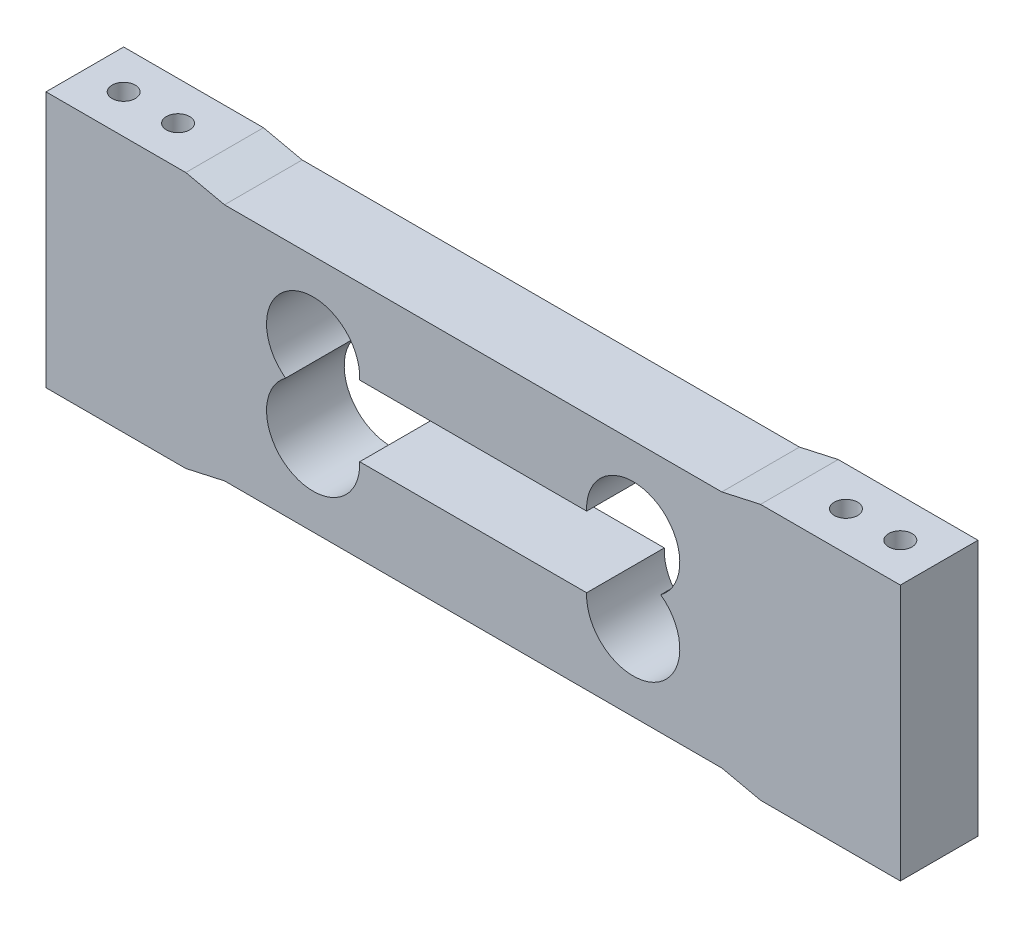
ISO-10303-21;
HEADER;
FILE_DESCRIPTION(('STEP AP214'),'2;1');
FILE_NAME('part.step','',(''),(''),'','','');
FILE_SCHEMA(('AUTOMOTIVE_DESIGN { 1 0 10303 214 1 1 1 1 }'));
ENDSEC;
DATA;
#1=APPLICATION_CONTEXT('core data for automotive mechanical design processes');
#2=APPLICATION_PROTOCOL_DEFINITION('international standard','automotive_design',2000,#1);
#3=PRODUCT_CONTEXT('',#1,'mechanical');
#4=PRODUCT('Part','Part','',(#3));
#5=PRODUCT_RELATED_PRODUCT_CATEGORY('part','',(#4));
#6=PRODUCT_DEFINITION_FORMATION('','',#4);
#7=PRODUCT_DEFINITION_CONTEXT('part definition',#1,'design');
#8=PRODUCT_DEFINITION('design','',#6,#7);
#9=PRODUCT_DEFINITION_SHAPE('','',#8);
#10=(LENGTH_UNIT() NAMED_UNIT(*) SI_UNIT(.MILLI.,.METRE.));
#11=(NAMED_UNIT(*) PLANE_ANGLE_UNIT() SI_UNIT($,.RADIAN.));
#12=(NAMED_UNIT(*) SI_UNIT($,.STERADIAN.) SOLID_ANGLE_UNIT());
#13=UNCERTAINTY_MEASURE_WITH_UNIT(LENGTH_MEASURE(1.E-05),#10,'distance_accuracy_value','');
#14=(GEOMETRIC_REPRESENTATION_CONTEXT(3) GLOBAL_UNCERTAINTY_ASSIGNED_CONTEXT((#13)) GLOBAL_UNIT_ASSIGNED_CONTEXT((#10,
#11,#12)) REPRESENTATION_CONTEXT('',''));
#15=CARTESIAN_POINT('',(0.,0.,0.));
#16=DIRECTION('',(0.,0.,1.));
#17=DIRECTION('',(1.,0.,0.));
#18=AXIS2_PLACEMENT_3D('',#15,#16,#17);
#19=CARTESIAN_POINT('',(0.,0.,5.));
#20=DIRECTION('',(0.,0.,-1.));
#21=DIRECTION('',(-1.,0.,0.));
#22=AXIS2_PLACEMENT_3D('',#19,#20,#21);
#23=PLANE('',#22);
#24=DIRECTION('',(0.,-1.,0.));
#25=VECTOR('',#24,1.);
#26=CARTESIAN_POINT('',(-55.,-16.5,5.));
#27=LINE('',#26,#25);
#28=CARTESIAN_POINT('',(-55.,16.5,5.));
#29=VERTEX_POINT('',#28);
#30=CARTESIAN_POINT('',(-55.,-16.5,5.));
#31=VERTEX_POINT('',#30);
#32=EDGE_CURVE('E235',#29,#31,#27,.T.);
#33=ORIENTED_EDGE('',*,*,#32,.T.);
#34=DIRECTION('',(1.,0.,0.));
#35=VECTOR('',#34,1.);
#36=CARTESIAN_POINT('',(-37.,-16.5,5.));
#37=LINE('',#36,#35);
#38=CARTESIAN_POINT('',(-37.,-16.5,5.));
#39=VERTEX_POINT('',#38);
#40=EDGE_CURVE('E239',#31,#39,#37,.T.);
#41=ORIENTED_EDGE('',*,*,#40,.T.);
#42=DIRECTION('',(0.976312980807911,0.216363036367056,0.));
#43=VECTOR('',#42,1.);
#44=CARTESIAN_POINT('',(-32.0158333710362,-15.3954470064409,5.));
#45=LINE('',#44,#43);
#46=CARTESIAN_POINT('',(-32.0158333710362,-15.3954470064409,5.));
#47=VERTEX_POINT('',#46);
#48=EDGE_CURVE('E243',#39,#47,#45,.T.);
#49=ORIENTED_EDGE('',*,*,#48,.T.);
#50=DIRECTION('',(1.,0.,0.));
#51=VECTOR('',#50,1.);
#52=CARTESIAN_POINT('',(32.0158333710362,-15.3954470064409,5.));
#53=LINE('',#52,#51);
#54=CARTESIAN_POINT('',(32.0158333710362,-15.3954470064409,5.));
#55=VERTEX_POINT('',#54);
#56=EDGE_CURVE('E246',#47,#55,#53,.T.);
#57=ORIENTED_EDGE('',*,*,#56,.T.);
#58=DIRECTION('',(0.976312980807911,-0.216363036367054,0.));
#59=VECTOR('',#58,1.);
#60=CARTESIAN_POINT('',(37.,-16.5,5.));
#61=LINE('',#60,#59);
#62=CARTESIAN_POINT('',(37.,-16.5,5.));
#63=VERTEX_POINT('',#62);
#64=EDGE_CURVE('E249',#55,#63,#61,.T.);
#65=ORIENTED_EDGE('',*,*,#64,.T.);
#66=DIRECTION('',(1.,0.,0.));
#67=VECTOR('',#66,1.);
#68=CARTESIAN_POINT('',(55.,-16.5,5.));
#69=LINE('',#68,#67);
#70=CARTESIAN_POINT('',(55.,-16.5,5.));
#71=VERTEX_POINT('',#70);
#72=EDGE_CURVE('E252',#63,#71,#69,.T.);
#73=ORIENTED_EDGE('',*,*,#72,.T.);
#74=DIRECTION('',(0.,1.,0.));
#75=VECTOR('',#74,1.);
#76=CARTESIAN_POINT('',(55.,16.5,5.));
#77=LINE('',#76,#75);
#78=CARTESIAN_POINT('',(55.,16.5,5.));
#79=VERTEX_POINT('',#78);
#80=EDGE_CURVE('E255',#71,#79,#77,.T.);
#81=ORIENTED_EDGE('',*,*,#80,.T.);
#82=DIRECTION('',(-1.,0.,0.));
#83=VECTOR('',#82,1.);
#84=CARTESIAN_POINT('',(37.,16.5,5.));
#85=LINE('',#84,#83);
#86=CARTESIAN_POINT('',(37.,16.5,5.));
#87=VERTEX_POINT('',#86);
#88=EDGE_CURVE('E258',#79,#87,#85,.T.);
#89=ORIENTED_EDGE('',*,*,#88,.T.);
#90=DIRECTION('',(-0.976312980807911,-0.216363036367057,0.));
#91=VECTOR('',#90,1.);
#92=CARTESIAN_POINT('',(32.0158333710362,15.3954470064409,5.));
#93=LINE('',#92,#91);
#94=CARTESIAN_POINT('',(32.0158333710362,15.3954470064409,5.));
#95=VERTEX_POINT('',#94);
#96=EDGE_CURVE('E261',#87,#95,#93,.T.);
#97=ORIENTED_EDGE('',*,*,#96,.T.);
#98=DIRECTION('',(-1.,0.,0.));
#99=VECTOR('',#98,1.);
#100=CARTESIAN_POINT('',(-32.0158333710362,15.3954470064409,5.));
#101=LINE('',#100,#99);
#102=CARTESIAN_POINT('',(-32.0158333710362,15.3954470064409,5.));
#103=VERTEX_POINT('',#102);
#104=EDGE_CURVE('E264',#95,#103,#101,.T.);
#105=ORIENTED_EDGE('',*,*,#104,.T.);
#106=DIRECTION('',(-0.97631298080791,0.216363036367059,0.));
#107=VECTOR('',#106,1.);
#108=CARTESIAN_POINT('',(-37.,16.5,5.));
#109=LINE('',#108,#107);
#110=CARTESIAN_POINT('',(-37.,16.5,5.));
#111=VERTEX_POINT('',#110);
#112=EDGE_CURVE('E267',#103,#111,#109,.T.);
#113=ORIENTED_EDGE('',*,*,#112,.T.);
#114=DIRECTION('',(-1.,0.,0.));
#115=VECTOR('',#114,1.);
#116=CARTESIAN_POINT('',(-55.,16.5,5.));
#117=LINE('',#116,#115);
#118=EDGE_CURVE('E270',#111,#29,#117,.T.);
#119=ORIENTED_EDGE('',*,*,#118,.T.);
#120=EDGE_LOOP('',(#33,#41,#49,#57,#65,#73,#81,#89,#97,#105,#113,#119));
#121=FACE_BOUND('',#120,.T.);
#122=CARTESIAN_POINT('',(20.6032817984294,4.83850138788346,5.));
#123=DIRECTION('',(0.,0.,1.));
#124=DIRECTION('',(-1.,0.,0.));
#125=AXIS2_PLACEMENT_3D('',#122,#123,#124);
#126=CIRCLE('',#125,6.);
#127=CARTESIAN_POINT('',(24.1513663971178,0.,5.));
#128=VERTEX_POINT('',#127);
#129=CARTESIAN_POINT('',(14.6102081086753,4.55028662563704,5.));
#130=VERTEX_POINT('',#129);
#131=EDGE_CURVE('E164',#128,#130,#126,.T.);
#132=ORIENTED_EDGE('',*,*,#131,.F.);
#133=CARTESIAN_POINT('',(20.6032817984294,-4.83850138788346,5.));
#134=DIRECTION('',(0.,0.,1.));
#135=DIRECTION('',(1.,0.,0.));
#136=AXIS2_PLACEMENT_3D('',#133,#134,#135);
#137=CIRCLE('',#136,6.);
#138=CARTESIAN_POINT('',(14.6102081086753,-4.55028662563704,5.));
#139=VERTEX_POINT('',#138);
#140=EDGE_CURVE('E200',#139,#128,#137,.T.);
#141=ORIENTED_EDGE('',*,*,#140,.F.);
#142=DIRECTION('',(1.,0.,0.));
#143=VECTOR('',#142,1.);
#144=CARTESIAN_POINT('',(-14.6102081086753,-4.55028662563704,5.));
#145=LINE('',#144,#143);
#146=CARTESIAN_POINT('',(-14.6102081086753,-4.55028662563704,5.));
#147=VERTEX_POINT('',#146);
#148=EDGE_CURVE('E197',#147,#139,#145,.T.);
#149=ORIENTED_EDGE('',*,*,#148,.F.);
#150=CARTESIAN_POINT('',(-20.6032817984294,-4.83850138788346,5.));
#151=DIRECTION('',(0.,0.,1.));
#152=DIRECTION('',(-1.,0.,0.));
#153=AXIS2_PLACEMENT_3D('',#150,#151,#152);
#154=CIRCLE('',#153,6.);
#155=CARTESIAN_POINT('',(-24.1513663971178,0.,5.));
#156=VERTEX_POINT('',#155);
#157=EDGE_CURVE('E191',#156,#147,#154,.T.);
#158=ORIENTED_EDGE('',*,*,#157,.F.);
#159=CARTESIAN_POINT('',(-20.6032817984294,4.83850138788346,5.));
#160=DIRECTION('',(0.,0.,1.));
#161=DIRECTION('',(1.,0.,0.));
#162=AXIS2_PLACEMENT_3D('',#159,#160,#161);
#163=CIRCLE('',#162,6.);
#164=CARTESIAN_POINT('',(-14.6102081086753,4.55028662563704,5.));
#165=VERTEX_POINT('',#164);
#166=EDGE_CURVE('E187',#165,#156,#163,.T.);
#167=ORIENTED_EDGE('',*,*,#166,.F.);
#168=DIRECTION('',(-1.,0.,0.));
#169=VECTOR('',#168,1.);
#170=CARTESIAN_POINT('',(-14.6102081086753,4.55028662563704,5.));
#171=LINE('',#170,#169);
#172=EDGE_CURVE('E173',#130,#165,#171,.T.);
#173=ORIENTED_EDGE('',*,*,#172,.F.);
#174=EDGE_LOOP('',(#132,#141,#149,#158,#167,#173));
#175=FACE_BOUND('',#174,.T.);
#176=ADVANCED_FACE('F38',(#121,#175),#23,.F.);
#177=CARTESIAN_POINT('',(0.,0.,-5.));
#178=DIRECTION('',(0.,0.,-1.));
#179=DIRECTION('',(-1.,0.,0.));
#180=AXIS2_PLACEMENT_3D('',#177,#178,#179);
#181=PLANE('',#180);
#182=DIRECTION('',(0.,-1.,0.));
#183=VECTOR('',#182,1.);
#184=CARTESIAN_POINT('',(-55.,-16.5,-5.));
#185=LINE('',#184,#183);
#186=CARTESIAN_POINT('',(-55.,16.5,-5.));
#187=VERTEX_POINT('',#186);
#188=CARTESIAN_POINT('',(-55.,-16.5,-5.));
#189=VERTEX_POINT('',#188);
#190=EDGE_CURVE('E182',#187,#189,#185,.T.);
#191=ORIENTED_EDGE('',*,*,#190,.F.);
#192=DIRECTION('',(-1.,0.,0.));
#193=VECTOR('',#192,1.);
#194=CARTESIAN_POINT('',(-55.,16.5,-5.));
#195=LINE('',#194,#193);
#196=CARTESIAN_POINT('',(-37.,16.5,-5.));
#197=VERTEX_POINT('',#196);
#198=EDGE_CURVE('E240',#197,#187,#195,.T.);
#199=ORIENTED_EDGE('',*,*,#198,.F.);
#200=DIRECTION('',(-0.97631298080791,0.216363036367059,0.));
#201=VECTOR('',#200,1.);
#202=CARTESIAN_POINT('',(-37.,16.5,-5.));
#203=LINE('',#202,#201);
#204=CARTESIAN_POINT('',(-32.0158333710362,15.3954470064409,-5.));
#205=VERTEX_POINT('',#204);
#206=EDGE_CURVE('E304',#205,#197,#203,.T.);
#207=ORIENTED_EDGE('',*,*,#206,.F.);
#208=DIRECTION('',(-1.,0.,0.));
#209=VECTOR('',#208,1.);
#210=CARTESIAN_POINT('',(-32.0158333710362,15.3954470064409,-5.));
#211=LINE('',#210,#209);
#212=CARTESIAN_POINT('',(32.0158333710362,15.3954470064409,-5.));
#213=VERTEX_POINT('',#212);
#214=EDGE_CURVE('E301',#213,#205,#211,.T.);
#215=ORIENTED_EDGE('',*,*,#214,.F.);
#216=DIRECTION('',(-0.976312980807911,-0.216363036367057,0.));
#217=VECTOR('',#216,1.);
#218=CARTESIAN_POINT('',(32.0158333710362,15.3954470064409,-5.));
#219=LINE('',#218,#217);
#220=CARTESIAN_POINT('',(37.,16.5,-5.));
#221=VERTEX_POINT('',#220);
#222=EDGE_CURVE('E298',#221,#213,#219,.T.);
#223=ORIENTED_EDGE('',*,*,#222,.F.);
#224=DIRECTION('',(-1.,0.,0.));
#225=VECTOR('',#224,1.);
#226=CARTESIAN_POINT('',(37.,16.5,-5.));
#227=LINE('',#226,#225);
#228=CARTESIAN_POINT('',(55.,16.5,-5.));
#229=VERTEX_POINT('',#228);
#230=EDGE_CURVE('E295',#229,#221,#227,.T.);
#231=ORIENTED_EDGE('',*,*,#230,.F.);
#232=DIRECTION('',(0.,1.,0.));
#233=VECTOR('',#232,1.);
#234=CARTESIAN_POINT('',(55.,16.5,-5.));
#235=LINE('',#234,#233);
#236=CARTESIAN_POINT('',(55.,-16.5,-5.));
#237=VERTEX_POINT('',#236);
#238=EDGE_CURVE('E292',#237,#229,#235,.T.);
#239=ORIENTED_EDGE('',*,*,#238,.F.);
#240=DIRECTION('',(1.,0.,0.));
#241=VECTOR('',#240,1.);
#242=CARTESIAN_POINT('',(55.,-16.5,-5.));
#243=LINE('',#242,#241);
#244=CARTESIAN_POINT('',(37.,-16.5,-5.));
#245=VERTEX_POINT('',#244);
#246=EDGE_CURVE('E289',#245,#237,#243,.T.);
#247=ORIENTED_EDGE('',*,*,#246,.F.);
#248=DIRECTION('',(0.976312980807911,-0.216363036367054,0.));
#249=VECTOR('',#248,1.);
#250=CARTESIAN_POINT('',(37.,-16.5,-5.));
#251=LINE('',#250,#249);
#252=CARTESIAN_POINT('',(32.0158333710362,-15.3954470064409,-5.));
#253=VERTEX_POINT('',#252);
#254=EDGE_CURVE('E286',#253,#245,#251,.T.);
#255=ORIENTED_EDGE('',*,*,#254,.F.);
#256=DIRECTION('',(1.,0.,0.));
#257=VECTOR('',#256,1.);
#258=CARTESIAN_POINT('',(32.0158333710362,-15.3954470064409,-5.));
#259=LINE('',#258,#257);
#260=CARTESIAN_POINT('',(-32.0158333710362,-15.3954470064409,-5.));
#261=VERTEX_POINT('',#260);
#262=EDGE_CURVE('E283',#261,#253,#259,.T.);
#263=ORIENTED_EDGE('',*,*,#262,.F.);
#264=DIRECTION('',(0.976312980807911,0.216363036367056,0.));
#265=VECTOR('',#264,1.);
#266=CARTESIAN_POINT('',(-32.0158333710362,-15.3954470064409,-5.));
#267=LINE('',#266,#265);
#268=CARTESIAN_POINT('',(-37.,-16.5,-5.));
#269=VERTEX_POINT('',#268);
#270=EDGE_CURVE('E280',#269,#261,#267,.T.);
#271=ORIENTED_EDGE('',*,*,#270,.F.);
#272=DIRECTION('',(1.,0.,0.));
#273=VECTOR('',#272,1.);
#274=CARTESIAN_POINT('',(-37.,-16.5,-5.));
#275=LINE('',#274,#273);
#276=EDGE_CURVE('E277',#189,#269,#275,.T.);
#277=ORIENTED_EDGE('',*,*,#276,.F.);
#278=EDGE_LOOP('',(#191,#199,#207,#215,#223,#231,#239,#247,#255,#263,#271,#277));
#279=FACE_BOUND('',#278,.T.);
#280=CARTESIAN_POINT('',(20.6032817984294,-4.83850138788346,-5.));
#281=DIRECTION('',(0.,0.,1.));
#282=DIRECTION('',(1.,0.,0.));
#283=AXIS2_PLACEMENT_3D('',#280,#281,#282);
#284=CIRCLE('',#283,6.);
#285=CARTESIAN_POINT('',(14.6102081086753,-4.55028662563704,-5.));
#286=VERTEX_POINT('',#285);
#287=CARTESIAN_POINT('',(24.1513663971178,0.,-5.));
#288=VERTEX_POINT('',#287);
#289=EDGE_CURVE('E174',#286,#288,#284,.T.);
#290=ORIENTED_EDGE('',*,*,#289,.T.);
#291=CARTESIAN_POINT('',(20.6032817984294,4.83850138788346,-5.));
#292=DIRECTION('',(0.,0.,1.));
#293=DIRECTION('',(-1.,0.,0.));
#294=AXIS2_PLACEMENT_3D('',#291,#292,#293);
#295=CIRCLE('',#294,6.);
#296=CARTESIAN_POINT('',(14.6102081086753,4.55028662563704,-5.));
#297=VERTEX_POINT('',#296);
#298=EDGE_CURVE('E62',#288,#297,#295,.T.);
#299=ORIENTED_EDGE('',*,*,#298,.T.);
#300=DIRECTION('',(-1.,0.,0.));
#301=VECTOR('',#300,1.);
#302=CARTESIAN_POINT('',(-14.6102081086753,4.55028662563704,-5.));
#303=LINE('',#302,#301);
#304=CARTESIAN_POINT('',(-14.6102081086753,4.55028662563704,-5.));
#305=VERTEX_POINT('',#304);
#306=EDGE_CURVE('E180',#297,#305,#303,.T.);
#307=ORIENTED_EDGE('',*,*,#306,.T.);
#308=CARTESIAN_POINT('',(-20.6032817984294,4.83850138788346,-5.));
#309=DIRECTION('',(0.,0.,1.));
#310=DIRECTION('',(1.,0.,0.));
#311=AXIS2_PLACEMENT_3D('',#308,#309,#310);
#312=CIRCLE('',#311,6.);
#313=CARTESIAN_POINT('',(-24.1513663971178,0.,-5.));
#314=VERTEX_POINT('',#313);
#315=EDGE_CURVE('E208',#305,#314,#312,.T.);
#316=ORIENTED_EDGE('',*,*,#315,.T.);
#317=CARTESIAN_POINT('',(-20.6032817984294,-4.83850138788346,-5.));
#318=DIRECTION('',(0.,0.,1.));
#319=DIRECTION('',(-1.,0.,0.));
#320=AXIS2_PLACEMENT_3D('',#317,#318,#319);
#321=CIRCLE('',#320,6.);
#322=CARTESIAN_POINT('',(-14.6102081086753,-4.55028662563704,-5.));
#323=VERTEX_POINT('',#322);
#324=EDGE_CURVE('E212',#314,#323,#321,.T.);
#325=ORIENTED_EDGE('',*,*,#324,.T.);
#326=DIRECTION('',(1.,0.,0.));
#327=VECTOR('',#326,1.);
#328=CARTESIAN_POINT('',(-14.6102081086753,-4.55028662563704,-5.));
#329=LINE('',#328,#327);
#330=EDGE_CURVE('E216',#323,#286,#329,.T.);
#331=ORIENTED_EDGE('',*,*,#330,.T.);
#332=EDGE_LOOP('',(#290,#299,#307,#316,#325,#331));
#333=FACE_BOUND('',#332,.T.);
#334=ADVANCED_FACE('F359',(#279,#333),#181,.T.);
#335=CARTESIAN_POINT('',(-55.,-16.5,5.));
#336=DIRECTION('',(1.,0.,0.));
#337=DIRECTION('',(0.,0.,-1.));
#338=AXIS2_PLACEMENT_3D('',#335,#336,#337);
#339=PLANE('',#338);
#340=ORIENTED_EDGE('',*,*,#190,.T.);
#341=DIRECTION('',(0.,0.,-1.));
#342=VECTOR('',#341,1.);
#343=CARTESIAN_POINT('',(-55.,-16.5,5.));
#344=LINE('',#343,#342);
#345=EDGE_CURVE('E11',#31,#189,#344,.T.);
#346=ORIENTED_EDGE('',*,*,#345,.F.);
#347=ORIENTED_EDGE('',*,*,#32,.F.);
#348=DIRECTION('',(0.,0.,-1.));
#349=VECTOR('',#348,1.);
#350=CARTESIAN_POINT('',(-55.,16.5,5.));
#351=LINE('',#350,#349);
#352=EDGE_CURVE('E273',#29,#187,#351,.T.);
#353=ORIENTED_EDGE('',*,*,#352,.T.);
#354=EDGE_LOOP('',(#340,#346,#347,#353));
#355=FACE_BOUND('',#354,.T.);
#356=ADVANCED_FACE('F40',(#355),#339,.F.);
#357=CARTESIAN_POINT('',(-37.,-16.5,5.));
#358=DIRECTION('',(0.,1.,0.));
#359=DIRECTION('',(-1.,0.,0.));
#360=AXIS2_PLACEMENT_3D('',#357,#358,#359);
#361=PLANE('',#360);
#362=CARTESIAN_POINT('',(-50.,-16.5,0.));
#363=DIRECTION('',(0.,1.,0.));
#364=DIRECTION('',(-1.,0.,0.));
#365=AXIS2_PLACEMENT_3D('',#362,#363,#364);
#366=CIRCLE('',#365,1.5);
#367=CARTESIAN_POINT('',(-51.5,-16.5,0.));
#368=VERTEX_POINT('',#367);
#369=EDGE_CURVE('E205',#368,#368,#366,.T.);
#370=ORIENTED_EDGE('',*,*,#369,.T.);
#371=EDGE_LOOP('',(#370));
#372=FACE_BOUND('',#371,.T.);
#373=CARTESIAN_POINT('',(-43.,-16.5,0.));
#374=DIRECTION('',(0.,1.,0.));
#375=DIRECTION('',(-1.,0.,0.));
#376=AXIS2_PLACEMENT_3D('',#373,#374,#375);
#377=CIRCLE('',#376,1.5);
#378=CARTESIAN_POINT('',(-44.5,-16.5,0.));
#379=VERTEX_POINT('',#378);
#380=EDGE_CURVE('E466',#379,#379,#377,.T.);
#381=ORIENTED_EDGE('',*,*,#380,.T.);
#382=EDGE_LOOP('',(#381));
#383=FACE_BOUND('',#382,.T.);
#384=ORIENTED_EDGE('',*,*,#276,.T.);
#385=DIRECTION('',(0.,0.,-1.));
#386=VECTOR('',#385,1.);
#387=CARTESIAN_POINT('',(-37.,-16.5,5.));
#388=LINE('',#387,#386);
#389=EDGE_CURVE('E47',#39,#269,#388,.T.);
#390=ORIENTED_EDGE('',*,*,#389,.F.);
#391=ORIENTED_EDGE('',*,*,#40,.F.);
#392=ORIENTED_EDGE('',*,*,#345,.T.);
#393=EDGE_LOOP('',(#384,#390,#391,#392));
#394=FACE_BOUND('',#393,.T.);
#395=ADVANCED_FACE('F376',(#372,#383,#394),#361,.F.);
#396=CARTESIAN_POINT('',(-32.0158333710362,-15.3954470064409,5.));
#397=DIRECTION('',(-0.216363036367056,0.976312980807911,0.));
#398=DIRECTION('',(-0.976312980807911,-0.216363036367056,0.));
#399=AXIS2_PLACEMENT_3D('',#396,#397,#398);
#400=PLANE('',#399);
#401=ORIENTED_EDGE('',*,*,#270,.T.);
#402=DIRECTION('',(0.,0.,-1.));
#403=VECTOR('',#402,1.);
#404=CARTESIAN_POINT('',(-32.0158333710362,-15.3954470064409,5.));
#405=LINE('',#404,#403);
#406=EDGE_CURVE('E344',#47,#261,#405,.T.);
#407=ORIENTED_EDGE('',*,*,#406,.F.);
#408=ORIENTED_EDGE('',*,*,#48,.F.);
#409=ORIENTED_EDGE('',*,*,#389,.T.);
#410=EDGE_LOOP('',(#401,#407,#408,#409));
#411=FACE_BOUND('',#410,.T.);
#412=ADVANCED_FACE('F353',(#411),#400,.F.);
#413=CARTESIAN_POINT('',(32.0158333710362,-15.3954470064409,5.));
#414=DIRECTION('',(0.,1.,0.));
#415=DIRECTION('',(-1.,0.,0.));
#416=AXIS2_PLACEMENT_3D('',#413,#414,#415);
#417=PLANE('',#416);
#418=ORIENTED_EDGE('',*,*,#262,.T.);
#419=DIRECTION('',(0.,0.,-1.));
#420=VECTOR('',#419,1.);
#421=CARTESIAN_POINT('',(32.0158333710362,-15.3954470064409,5.));
#422=LINE('',#421,#420);
#423=EDGE_CURVE('E340',#55,#253,#422,.T.);
#424=ORIENTED_EDGE('',*,*,#423,.F.);
#425=ORIENTED_EDGE('',*,*,#56,.F.);
#426=ORIENTED_EDGE('',*,*,#406,.T.);
#427=EDGE_LOOP('',(#418,#424,#425,#426));
#428=FACE_BOUND('',#427,.T.);
#429=ADVANCED_FACE('F365',(#428),#417,.F.);
#430=CARTESIAN_POINT('',(37.,-16.5,5.));
#431=DIRECTION('',(0.216363036367054,0.976312980807911,0.));
#432=DIRECTION('',(-0.976312980807911,0.216363036367054,0.));
#433=AXIS2_PLACEMENT_3D('',#430,#431,#432);
#434=PLANE('',#433);
#435=ORIENTED_EDGE('',*,*,#254,.T.);
#436=DIRECTION('',(0.,0.,-1.));
#437=VECTOR('',#436,1.);
#438=CARTESIAN_POINT('',(37.,-16.5,5.));
#439=LINE('',#438,#437);
#440=EDGE_CURVE('E336',#63,#245,#439,.T.);
#441=ORIENTED_EDGE('',*,*,#440,.F.);
#442=ORIENTED_EDGE('',*,*,#64,.F.);
#443=ORIENTED_EDGE('',*,*,#423,.T.);
#444=EDGE_LOOP('',(#435,#441,#442,#443));
#445=FACE_BOUND('',#444,.T.);
#446=ADVANCED_FACE('F369',(#445),#434,.F.);
#447=CARTESIAN_POINT('',(55.,-16.5,5.));
#448=DIRECTION('',(0.,1.,0.));
#449=DIRECTION('',(-1.,0.,0.));
#450=AXIS2_PLACEMENT_3D('',#447,#448,#449);
#451=PLANE('',#450);
#452=CARTESIAN_POINT('',(43.,-16.5,0.));
#453=DIRECTION('',(0.,1.,0.));
#454=DIRECTION('',(-1.,0.,0.));
#455=AXIS2_PLACEMENT_3D('',#452,#453,#454);
#456=CIRCLE('',#455,1.5);
#457=CARTESIAN_POINT('',(41.5,-16.5,0.));
#458=VERTEX_POINT('',#457);
#459=EDGE_CURVE('E459',#458,#458,#456,.T.);
#460=ORIENTED_EDGE('',*,*,#459,.T.);
#461=EDGE_LOOP('',(#460));
#462=FACE_BOUND('',#461,.T.);
#463=CARTESIAN_POINT('',(50.,-16.5,0.));
#464=DIRECTION('',(0.,1.,0.));
#465=DIRECTION('',(-1.,0.,0.));
#466=AXIS2_PLACEMENT_3D('',#463,#464,#465);
#467=CIRCLE('',#466,1.5);
#468=CARTESIAN_POINT('',(48.5,-16.5,0.));
#469=VERTEX_POINT('',#468);
#470=EDGE_CURVE('E452',#469,#469,#467,.T.);
#471=ORIENTED_EDGE('',*,*,#470,.T.);
#472=EDGE_LOOP('',(#471));
#473=FACE_BOUND('',#472,.T.);
#474=ORIENTED_EDGE('',*,*,#246,.T.);
#475=DIRECTION('',(0.,0.,-1.));
#476=VECTOR('',#475,1.);
#477=CARTESIAN_POINT('',(55.,-16.5,5.));
#478=LINE('',#477,#476);
#479=EDGE_CURVE('E332',#71,#237,#478,.T.);
#480=ORIENTED_EDGE('',*,*,#479,.F.);
#481=ORIENTED_EDGE('',*,*,#72,.F.);
#482=ORIENTED_EDGE('',*,*,#440,.T.);
#483=EDGE_LOOP('',(#474,#480,#481,#482));
#484=FACE_BOUND('',#483,.T.);
#485=ADVANCED_FACE('F409',(#462,#473,#484),#451,.F.);
#486=CARTESIAN_POINT('',(55.,16.5,5.));
#487=DIRECTION('',(-1.,0.,0.));
#488=DIRECTION('',(0.,0.,1.));
#489=AXIS2_PLACEMENT_3D('',#486,#487,#488);
#490=PLANE('',#489);
#491=ORIENTED_EDGE('',*,*,#238,.T.);
#492=DIRECTION('',(0.,0.,-1.));
#493=VECTOR('',#492,1.);
#494=CARTESIAN_POINT('',(55.,16.5,5.));
#495=LINE('',#494,#493);
#496=EDGE_CURVE('E328',#79,#229,#495,.T.);
#497=ORIENTED_EDGE('',*,*,#496,.F.);
#498=ORIENTED_EDGE('',*,*,#80,.F.);
#499=ORIENTED_EDGE('',*,*,#479,.T.);
#500=EDGE_LOOP('',(#491,#497,#498,#499));
#501=FACE_BOUND('',#500,.T.);
#502=ADVANCED_FACE('F407',(#501),#490,.F.);
#503=CARTESIAN_POINT('',(37.,16.5,5.));
#504=DIRECTION('',(0.,-1.,0.));
#505=DIRECTION('',(1.,0.,0.));
#506=AXIS2_PLACEMENT_3D('',#503,#504,#505);
#507=PLANE('',#506);
#508=CARTESIAN_POINT('',(43.,16.5,0.));
#509=DIRECTION('',(0.,1.,0.));
#510=DIRECTION('',(-1.,0.,0.));
#511=AXIS2_PLACEMENT_3D('',#508,#509,#510);
#512=CIRCLE('',#511,1.5);
#513=CARTESIAN_POINT('',(41.5,16.5,0.));
#514=VERTEX_POINT('',#513);
#515=EDGE_CURVE('E446',#514,#514,#512,.T.);
#516=ORIENTED_EDGE('',*,*,#515,.F.);
#517=EDGE_LOOP('',(#516));
#518=FACE_BOUND('',#517,.T.);
#519=CARTESIAN_POINT('',(50.,16.5,0.));
#520=DIRECTION('',(0.,1.,0.));
#521=DIRECTION('',(-1.,0.,0.));
#522=AXIS2_PLACEMENT_3D('',#519,#520,#521);
#523=CIRCLE('',#522,1.5);
#524=CARTESIAN_POINT('',(48.5,16.5,0.));
#525=VERTEX_POINT('',#524);
#526=EDGE_CURVE('E449',#525,#525,#523,.T.);
#527=ORIENTED_EDGE('',*,*,#526,.F.);
#528=EDGE_LOOP('',(#527));
#529=FACE_BOUND('',#528,.T.);
#530=ORIENTED_EDGE('',*,*,#230,.T.);
#531=DIRECTION('',(0.,0.,-1.));
#532=VECTOR('',#531,1.);
#533=CARTESIAN_POINT('',(37.,16.5,5.));
#534=LINE('',#533,#532);
#535=EDGE_CURVE('E324',#87,#221,#534,.T.);
#536=ORIENTED_EDGE('',*,*,#535,.F.);
#537=ORIENTED_EDGE('',*,*,#88,.F.);
#538=ORIENTED_EDGE('',*,*,#496,.T.);
#539=EDGE_LOOP('',(#530,#536,#537,#538));
#540=FACE_BOUND('',#539,.T.);
#541=ADVANCED_FACE('F403',(#518,#529,#540),#507,.F.);
#542=CARTESIAN_POINT('',(32.0158333710362,15.3954470064409,5.));
#543=DIRECTION('',(0.216363036367057,-0.976312980807911,0.));
#544=DIRECTION('',(0.976312980807911,0.216363036367057,0.));
#545=AXIS2_PLACEMENT_3D('',#542,#543,#544);
#546=PLANE('',#545);
#547=ORIENTED_EDGE('',*,*,#222,.T.);
#548=DIRECTION('',(0.,0.,-1.));
#549=VECTOR('',#548,1.);
#550=CARTESIAN_POINT('',(32.0158333710362,15.3954470064409,5.));
#551=LINE('',#550,#549);
#552=EDGE_CURVE('E320',#95,#213,#551,.T.);
#553=ORIENTED_EDGE('',*,*,#552,.F.);
#554=ORIENTED_EDGE('',*,*,#96,.F.);
#555=ORIENTED_EDGE('',*,*,#535,.T.);
#556=EDGE_LOOP('',(#547,#553,#554,#555));
#557=FACE_BOUND('',#556,.T.);
#558=ADVANCED_FACE('F398',(#557),#546,.F.);
#559=CARTESIAN_POINT('',(-32.0158333710362,15.3954470064409,5.));
#560=DIRECTION('',(0.,-1.,0.));
#561=DIRECTION('',(1.,0.,0.));
#562=AXIS2_PLACEMENT_3D('',#559,#560,#561);
#563=PLANE('',#562);
#564=ORIENTED_EDGE('',*,*,#214,.T.);
#565=DIRECTION('',(0.,0.,-1.));
#566=VECTOR('',#565,1.);
#567=CARTESIAN_POINT('',(-32.0158333710362,15.3954470064409,5.));
#568=LINE('',#567,#566);
#569=EDGE_CURVE('E316',#103,#205,#568,.T.);
#570=ORIENTED_EDGE('',*,*,#569,.F.);
#571=ORIENTED_EDGE('',*,*,#104,.F.);
#572=ORIENTED_EDGE('',*,*,#552,.T.);
#573=EDGE_LOOP('',(#564,#570,#571,#572));
#574=FACE_BOUND('',#573,.T.);
#575=ADVANCED_FACE('F392',(#574),#563,.F.);
#576=CARTESIAN_POINT('',(-37.,16.5,5.));
#577=DIRECTION('',(-0.216363036367059,-0.97631298080791,0.));
#578=DIRECTION('',(0.97631298080791,-0.216363036367059,0.));
#579=AXIS2_PLACEMENT_3D('',#576,#577,#578);
#580=PLANE('',#579);
#581=ORIENTED_EDGE('',*,*,#206,.T.);
#582=DIRECTION('',(0.,0.,-1.));
#583=VECTOR('',#582,1.);
#584=CARTESIAN_POINT('',(-37.,16.5,5.));
#585=LINE('',#584,#583);
#586=EDGE_CURVE('E312',#111,#197,#585,.T.);
#587=ORIENTED_EDGE('',*,*,#586,.F.);
#588=ORIENTED_EDGE('',*,*,#112,.F.);
#589=ORIENTED_EDGE('',*,*,#569,.T.);
#590=EDGE_LOOP('',(#581,#587,#588,#589));
#591=FACE_BOUND('',#590,.T.);
#592=ADVANCED_FACE('F388',(#591),#580,.F.);
#593=CARTESIAN_POINT('',(-55.,16.5,5.));
#594=DIRECTION('',(0.,-1.,0.));
#595=DIRECTION('',(1.,0.,0.));
#596=AXIS2_PLACEMENT_3D('',#593,#594,#595);
#597=PLANE('',#596);
#598=CARTESIAN_POINT('',(-50.,16.5,0.));
#599=DIRECTION('',(0.,1.,0.));
#600=DIRECTION('',(-1.,0.,0.));
#601=AXIS2_PLACEMENT_3D('',#598,#599,#600);
#602=CIRCLE('',#601,1.5);
#603=CARTESIAN_POINT('',(-51.5,16.5,0.));
#604=VERTEX_POINT('',#603);
#605=EDGE_CURVE('E470',#604,#604,#602,.T.);
#606=ORIENTED_EDGE('',*,*,#605,.F.);
#607=EDGE_LOOP('',(#606));
#608=FACE_BOUND('',#607,.T.);
#609=CARTESIAN_POINT('',(-43.,16.5,0.));
#610=DIRECTION('',(0.,1.,0.));
#611=DIRECTION('',(-1.,0.,0.));
#612=AXIS2_PLACEMENT_3D('',#609,#610,#611);
#613=CIRCLE('',#612,1.5);
#614=CARTESIAN_POINT('',(-44.5,16.5,0.));
#615=VERTEX_POINT('',#614);
#616=EDGE_CURVE('E462',#615,#615,#613,.T.);
#617=ORIENTED_EDGE('',*,*,#616,.F.);
#618=EDGE_LOOP('',(#617));
#619=FACE_BOUND('',#618,.T.);
#620=ORIENTED_EDGE('',*,*,#198,.T.);
#621=ORIENTED_EDGE('',*,*,#352,.F.);
#622=ORIENTED_EDGE('',*,*,#118,.F.);
#623=ORIENTED_EDGE('',*,*,#586,.T.);
#624=EDGE_LOOP('',(#620,#621,#622,#623));
#625=FACE_BOUND('',#624,.T.);
#626=ADVANCED_FACE('F383',(#608,#619,#625),#597,.F.);
#627=CARTESIAN_POINT('',(20.6032817984294,4.83850138788346,5.));
#628=DIRECTION('',(0.,0.,-1.));
#629=DIRECTION('',(-1.,0.,0.));
#630=AXIS2_PLACEMENT_3D('',#627,#628,#629);
#631=CYLINDRICAL_SURFACE('',#630,6.);
#632=ORIENTED_EDGE('',*,*,#298,.F.);
#633=DIRECTION('',(0.,0.,-1.));
#634=VECTOR('',#633,1.);
#635=CARTESIAN_POINT('',(24.1513663971178,0.,5.));
#636=LINE('',#635,#634);
#637=EDGE_CURVE('E168',#128,#288,#636,.T.);
#638=ORIENTED_EDGE('',*,*,#637,.F.);
#639=ORIENTED_EDGE('',*,*,#131,.T.);
#640=DIRECTION('',(0.,0.,-1.));
#641=VECTOR('',#640,1.);
#642=CARTESIAN_POINT('',(14.6102081086753,4.55028662563704,5.));
#643=LINE('',#642,#641);
#644=EDGE_CURVE('E167',#130,#297,#643,.T.);
#645=ORIENTED_EDGE('',*,*,#644,.T.);
#646=EDGE_LOOP('',(#632,#638,#639,#645));
#647=FACE_BOUND('',#646,.T.);
#648=ADVANCED_FACE('F166',(#647),#631,.F.);
#649=CARTESIAN_POINT('',(-14.6102081086753,4.55028662563704,5.));
#650=DIRECTION('',(0.,-1.,0.));
#651=DIRECTION('',(0.,0.,-1.));
#652=AXIS2_PLACEMENT_3D('',#649,#650,#651);
#653=PLANE('',#652);
#654=ORIENTED_EDGE('',*,*,#306,.F.);
#655=ORIENTED_EDGE('',*,*,#644,.F.);
#656=ORIENTED_EDGE('',*,*,#172,.T.);
#657=DIRECTION('',(0.,0.,-1.));
#658=VECTOR('',#657,1.);
#659=CARTESIAN_POINT('',(-14.6102081086753,4.55028662563704,5.));
#660=LINE('',#659,#658);
#661=EDGE_CURVE('E183',#165,#305,#660,.T.);
#662=ORIENTED_EDGE('',*,*,#661,.T.);
#663=EDGE_LOOP('',(#654,#655,#656,#662));
#664=FACE_BOUND('',#663,.T.);
#665=ADVANCED_FACE('F177',(#664),#653,.T.);
#666=CARTESIAN_POINT('',(-20.6032817984294,4.83850138788346,5.));
#667=DIRECTION('',(0.,0.,-1.));
#668=DIRECTION('',(-1.,0.,0.));
#669=AXIS2_PLACEMENT_3D('',#666,#667,#668);
#670=CYLINDRICAL_SURFACE('',#669,6.);
#671=ORIENTED_EDGE('',*,*,#315,.F.);
#672=ORIENTED_EDGE('',*,*,#661,.F.);
#673=ORIENTED_EDGE('',*,*,#166,.T.);
#674=DIRECTION('',(0.,0.,-1.));
#675=VECTOR('',#674,1.);
#676=CARTESIAN_POINT('',(-24.1513663971178,0.,5.));
#677=LINE('',#676,#675);
#678=EDGE_CURVE('E230',#156,#314,#677,.T.);
#679=ORIENTED_EDGE('',*,*,#678,.T.);
#680=EDGE_LOOP('',(#671,#672,#673,#679));
#681=FACE_BOUND('',#680,.T.);
#682=ADVANCED_FACE('F514',(#681),#670,.F.);
#683=CARTESIAN_POINT('',(-20.6032817984294,-4.83850138788346,5.));
#684=DIRECTION('',(0.,0.,-1.));
#685=DIRECTION('',(-1.,0.,0.));
#686=AXIS2_PLACEMENT_3D('',#683,#684,#685);
#687=CYLINDRICAL_SURFACE('',#686,6.);
#688=ORIENTED_EDGE('',*,*,#324,.F.);
#689=ORIENTED_EDGE('',*,*,#678,.F.);
#690=ORIENTED_EDGE('',*,*,#157,.T.);
#691=DIRECTION('',(0.,0.,-1.));
#692=VECTOR('',#691,1.);
#693=CARTESIAN_POINT('',(-14.6102081086753,-4.55028662563704,5.));
#694=LINE('',#693,#692);
#695=EDGE_CURVE('E227',#147,#323,#694,.T.);
#696=ORIENTED_EDGE('',*,*,#695,.T.);
#697=EDGE_LOOP('',(#688,#689,#690,#696));
#698=FACE_BOUND('',#697,.T.);
#699=ADVANCED_FACE('F510',(#698),#687,.F.);
#700=CARTESIAN_POINT('',(-14.6102081086753,-4.55028662563704,5.));
#701=DIRECTION('',(0.,1.,0.));
#702=DIRECTION('',(0.,0.,1.));
#703=AXIS2_PLACEMENT_3D('',#700,#701,#702);
#704=PLANE('',#703);
#705=ORIENTED_EDGE('',*,*,#330,.F.);
#706=ORIENTED_EDGE('',*,*,#695,.F.);
#707=ORIENTED_EDGE('',*,*,#148,.T.);
#708=DIRECTION('',(0.,0.,-1.));
#709=VECTOR('',#708,1.);
#710=CARTESIAN_POINT('',(14.6102081086753,-4.55028662563704,5.));
#711=LINE('',#710,#709);
#712=EDGE_CURVE('E54',#139,#286,#711,.T.);
#713=ORIENTED_EDGE('',*,*,#712,.T.);
#714=EDGE_LOOP('',(#705,#706,#707,#713));
#715=FACE_BOUND('',#714,.T.);
#716=ADVANCED_FACE('F497',(#715),#704,.T.);
#717=CARTESIAN_POINT('',(20.6032817984294,-4.83850138788346,5.));
#718=DIRECTION('',(0.,0.,-1.));
#719=DIRECTION('',(-1.,0.,0.));
#720=AXIS2_PLACEMENT_3D('',#717,#718,#719);
#721=CYLINDRICAL_SURFACE('',#720,6.);
#722=ORIENTED_EDGE('',*,*,#289,.F.);
#723=ORIENTED_EDGE('',*,*,#712,.F.);
#724=ORIENTED_EDGE('',*,*,#140,.T.);
#725=ORIENTED_EDGE('',*,*,#637,.T.);
#726=EDGE_LOOP('',(#722,#723,#724,#725));
#727=FACE_BOUND('',#726,.T.);
#728=ADVANCED_FACE('F491',(#727),#721,.F.);
#729=CARTESIAN_POINT('',(-43.,-16.5,0.));
#730=DIRECTION('',(0.,1.,0.));
#731=DIRECTION('',(-1.,0.,0.));
#732=AXIS2_PLACEMENT_3D('',#729,#730,#731);
#733=CYLINDRICAL_SURFACE('',#732,1.5);
#734=ORIENTED_EDGE('',*,*,#380,.F.);
#735=EDGE_LOOP('',(#734));
#736=FACE_BOUND('',#735,.T.);
#737=ORIENTED_EDGE('',*,*,#616,.T.);
#738=EDGE_LOOP('',(#737));
#739=FACE_BOUND('',#738,.T.);
#740=ADVANCED_FACE('F484',(#736,#739),#733,.F.);
#741=CARTESIAN_POINT('',(-50.,-16.5,0.));
#742=DIRECTION('',(0.,1.,0.));
#743=DIRECTION('',(-1.,0.,0.));
#744=AXIS2_PLACEMENT_3D('',#741,#742,#743);
#745=CYLINDRICAL_SURFACE('',#744,1.5);
#746=ORIENTED_EDGE('',*,*,#369,.F.);
#747=EDGE_LOOP('',(#746));
#748=FACE_BOUND('',#747,.T.);
#749=ORIENTED_EDGE('',*,*,#605,.T.);
#750=EDGE_LOOP('',(#749));
#751=FACE_BOUND('',#750,.T.);
#752=ADVANCED_FACE('F480',(#748,#751),#745,.F.);
#753=CARTESIAN_POINT('',(50.,-16.5,0.));
#754=DIRECTION('',(0.,1.,0.));
#755=DIRECTION('',(-1.,0.,0.));
#756=AXIS2_PLACEMENT_3D('',#753,#754,#755);
#757=CYLINDRICAL_SURFACE('',#756,1.5);
#758=ORIENTED_EDGE('',*,*,#470,.F.);
#759=EDGE_LOOP('',(#758));
#760=FACE_BOUND('',#759,.T.);
#761=ORIENTED_EDGE('',*,*,#526,.T.);
#762=EDGE_LOOP('',(#761));
#763=FACE_BOUND('',#762,.T.);
#764=ADVANCED_FACE('F483',(#760,#763),#757,.F.);
#765=CARTESIAN_POINT('',(43.,-16.5,0.));
#766=DIRECTION('',(0.,1.,0.));
#767=DIRECTION('',(-1.,0.,0.));
#768=AXIS2_PLACEMENT_3D('',#765,#766,#767);
#769=CYLINDRICAL_SURFACE('',#768,1.5);
#770=ORIENTED_EDGE('',*,*,#459,.F.);
#771=EDGE_LOOP('',(#770));
#772=FACE_BOUND('',#771,.T.);
#773=ORIENTED_EDGE('',*,*,#515,.T.);
#774=EDGE_LOOP('',(#773));
#775=FACE_BOUND('',#774,.T.);
#776=ADVANCED_FACE('F501',(#772,#775),#769,.F.);
#777=CLOSED_SHELL('',(#176,#334,#356,#395,#412,#429,#446,#485,#502,#541,#558,#575,#592,#626,
#648,#665,#682,#699,#716,#728,#740,#752,#764,#776));
#778=MANIFOLD_SOLID_BREP('B2',#777);
#779=ADVANCED_BREP_SHAPE_REPRESENTATION('',(#18,#778),#14);
#780=SHAPE_DEFINITION_REPRESENTATION(#9,#779);
ENDSEC;
END-ISO-10303-21;
